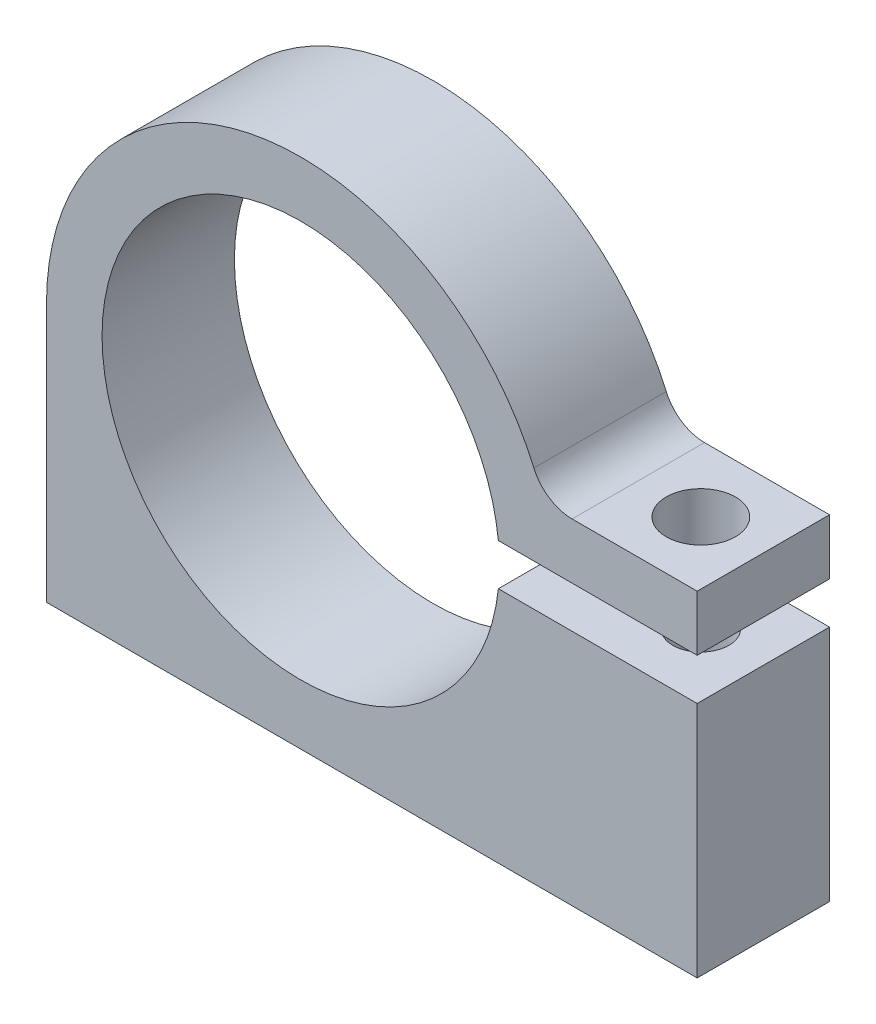
ISO-10303-21;
HEADER;
FILE_DESCRIPTION(('STEP AP214'),'2;1');
FILE_NAME('part.step','',(''),(''),'','','');
FILE_SCHEMA(('AUTOMOTIVE_DESIGN { 1 0 10303 214 1 1 1 1 }'));
ENDSEC;
DATA;
#1=APPLICATION_CONTEXT('core data for automotive mechanical design processes');
#2=APPLICATION_PROTOCOL_DEFINITION('international standard','automotive_design',2000,#1);
#3=PRODUCT_CONTEXT('',#1,'mechanical');
#4=PRODUCT('Part','Part','',(#3));
#5=PRODUCT_RELATED_PRODUCT_CATEGORY('part','',(#4));
#6=PRODUCT_DEFINITION_FORMATION('','',#4);
#7=PRODUCT_DEFINITION_CONTEXT('part definition',#1,'design');
#8=PRODUCT_DEFINITION('design','',#6,#7);
#9=PRODUCT_DEFINITION_SHAPE('','',#8);
#10=(LENGTH_UNIT() NAMED_UNIT(*) SI_UNIT(.MILLI.,.METRE.));
#11=(NAMED_UNIT(*) PLANE_ANGLE_UNIT() SI_UNIT($,.RADIAN.));
#12=(NAMED_UNIT(*) SI_UNIT($,.STERADIAN.) SOLID_ANGLE_UNIT());
#13=UNCERTAINTY_MEASURE_WITH_UNIT(LENGTH_MEASURE(1.E-05),#10,'distance_accuracy_value','');
#14=(GEOMETRIC_REPRESENTATION_CONTEXT(3) GLOBAL_UNCERTAINTY_ASSIGNED_CONTEXT((#13)) GLOBAL_UNIT_ASSIGNED_CONTEXT((#10,
#11,#12)) REPRESENTATION_CONTEXT('',''));
#15=CARTESIAN_POINT('',(0.,0.,0.));
#16=DIRECTION('',(0.,0.,1.));
#17=DIRECTION('',(1.,0.,0.));
#18=AXIS2_PLACEMENT_3D('',#15,#16,#17);
#19=CARTESIAN_POINT('',(0.,5.49999999999999,9.525));
#20=DIRECTION('',(0.,-1.,0.));
#21=DIRECTION('',(1.,0.,0.));
#22=AXIS2_PLACEMENT_3D('',#19,#20,#21);
#23=PLANE('',#22);
#24=CARTESIAN_POINT('',(24.0304889851739,5.5,4.7625));
#25=DIRECTION('',(0.,1.,0.));
#26=DIRECTION('',(0.,0.,1.));
#27=AXIS2_PLACEMENT_3D('',#24,#25,#26);
#28=CIRCLE('',#27,2.4892);
#29=CARTESIAN_POINT('',(24.0304889851739,5.5,7.2517));
#30=VERTEX_POINT('',#29);
#31=EDGE_CURVE('E215',#30,#30,#28,.T.);
#32=ORIENTED_EDGE('',*,*,#31,.F.);
#33=EDGE_LOOP('',(#32));
#34=FACE_BOUND('',#33,.T.);
#35=DIRECTION('',(-1.,0.,0.));
#36=VECTOR('',#35,1.);
#37=CARTESIAN_POINT('',(0.,5.49999999999999,0.));
#38=LINE('',#37,#36);
#39=CARTESIAN_POINT('',(28.5304889851739,5.5,0.));
#40=VERTEX_POINT('',#39);
#41=CARTESIAN_POINT('',(19.5304889851739,5.5,0.));
#42=VERTEX_POINT('',#41);
#43=EDGE_CURVE('E151',#40,#42,#38,.T.);
#44=ORIENTED_EDGE('',*,*,#43,.T.);
#45=DIRECTION('',(0.,0.,-1.));
#46=VECTOR('',#45,1.);
#47=CARTESIAN_POINT('',(19.5304889851739,5.5,9.525));
#48=LINE('',#47,#46);
#49=CARTESIAN_POINT('',(19.5304889851739,5.5,9.525));
#50=VERTEX_POINT('',#49);
#51=EDGE_CURVE('E11',#50,#42,#48,.T.);
#52=ORIENTED_EDGE('',*,*,#51,.F.);
#53=DIRECTION('',(-1.,0.,0.));
#54=VECTOR('',#53,1.);
#55=CARTESIAN_POINT('',(0.,5.49999999999999,9.525));
#56=LINE('',#55,#54);
#57=CARTESIAN_POINT('',(28.5304889851739,5.5,9.525));
#58=VERTEX_POINT('',#57);
#59=EDGE_CURVE('E173',#58,#50,#56,.T.);
#60=ORIENTED_EDGE('',*,*,#59,.F.);
#61=DIRECTION('',(0.,0.,-1.));
#62=VECTOR('',#61,1.);
#63=CARTESIAN_POINT('',(28.5304889851739,5.5,9.525));
#64=LINE('',#63,#62);
#65=EDGE_CURVE('E150',#58,#40,#64,.T.);
#66=ORIENTED_EDGE('',*,*,#65,.T.);
#67=EDGE_LOOP('',(#44,#52,#60,#66));
#68=FACE_BOUND('',#67,.T.);
#69=ADVANCED_FACE('F39',(#34,#68),#23,.F.);
#70=CARTESIAN_POINT('',(19.5304889851739,8.5,9.525));
#71=DIRECTION('',(0.,0.,-1.));
#72=DIRECTION('',(-1.,0.,0.));
#73=AXIS2_PLACEMENT_3D('',#70,#71,#72);
#74=CYLINDRICAL_SURFACE('',#73,3.);
#75=CARTESIAN_POINT('',(19.5304889851739,8.5,0.));
#76=DIRECTION('',(0.,0.,1.));
#77=DIRECTION('',(1.,0.,0.));
#78=AXIS2_PLACEMENT_3D('',#75,#76,#77);
#79=CIRCLE('',#78,3.);
#80=CARTESIAN_POINT('',(16.7797158886706,7.30281690140845,0.));
#81=VERTEX_POINT('',#80);
#82=EDGE_CURVE('E154',#42,#81,#79,.F.);
#83=ORIENTED_EDGE('',*,*,#82,.T.);
#84=DIRECTION('',(0.,0.,-1.));
#85=VECTOR('',#84,1.);
#86=CARTESIAN_POINT('',(16.7797158886706,7.30281690140845,9.525));
#87=LINE('',#86,#85);
#88=CARTESIAN_POINT('',(16.7797158886706,7.30281690140845,9.525));
#89=VERTEX_POINT('',#88);
#90=EDGE_CURVE('E47',#89,#81,#87,.T.);
#91=ORIENTED_EDGE('',*,*,#90,.F.);
#92=CARTESIAN_POINT('',(19.5304889851739,8.5,9.525));
#93=DIRECTION('',(0.,0.,1.));
#94=DIRECTION('',(1.,0.,0.));
#95=AXIS2_PLACEMENT_3D('',#92,#93,#94);
#96=CIRCLE('',#95,3.);
#97=EDGE_CURVE('E104',#50,#89,#96,.F.);
#98=ORIENTED_EDGE('',*,*,#97,.F.);
#99=ORIENTED_EDGE('',*,*,#51,.T.);
#100=EDGE_LOOP('',(#83,#91,#98,#99));
#101=FACE_BOUND('',#100,.T.);
#102=ADVANCED_FACE('F271',(#101),#74,.F.);
#103=CARTESIAN_POINT('',(0.,0.,9.525));
#104=DIRECTION('',(0.,0.,-1.));
#105=DIRECTION('',(-1.,0.,0.));
#106=AXIS2_PLACEMENT_3D('',#103,#104,#105);
#107=CYLINDRICAL_SURFACE('',#106,18.3);
#108=CARTESIAN_POINT('',(0.,0.,0.));
#109=DIRECTION('',(0.,0.,1.));
#110=DIRECTION('',(1.,0.,0.));
#111=AXIS2_PLACEMENT_3D('',#108,#109,#110);
#112=CIRCLE('',#111,18.3);
#113=CARTESIAN_POINT('',(-18.3,0.,0.));
#114=VERTEX_POINT('',#113);
#115=EDGE_CURVE('E157',#81,#114,#112,.T.);
#116=ORIENTED_EDGE('',*,*,#115,.T.);
#117=DIRECTION('',(0.,0.,-1.));
#118=VECTOR('',#117,1.);
#119=CARTESIAN_POINT('',(-18.3,0.,9.525));
#120=LINE('',#119,#118);
#121=CARTESIAN_POINT('',(-18.3,0.,9.525));
#122=VERTEX_POINT('',#121);
#123=EDGE_CURVE('E184',#122,#114,#120,.T.);
#124=ORIENTED_EDGE('',*,*,#123,.F.);
#125=CARTESIAN_POINT('',(0.,0.,9.525));
#126=DIRECTION('',(0.,0.,1.));
#127=DIRECTION('',(1.,0.,0.));
#128=AXIS2_PLACEMENT_3D('',#125,#126,#127);
#129=CIRCLE('',#128,18.3);
#130=EDGE_CURVE('E192',#89,#122,#129,.T.);
#131=ORIENTED_EDGE('',*,*,#130,.F.);
#132=ORIENTED_EDGE('',*,*,#90,.T.);
#133=EDGE_LOOP('',(#116,#124,#131,#132));
#134=FACE_BOUND('',#133,.T.);
#135=ADVANCED_FACE('F190',(#134),#107,.T.);
#136=CARTESIAN_POINT('',(-18.3,0.,9.525));
#137=DIRECTION('',(1.,0.,0.));
#138=DIRECTION('',(0.,1.,0.));
#139=AXIS2_PLACEMENT_3D('',#136,#137,#138);
#140=PLANE('',#139);
#141=DIRECTION('',(0.,-1.,0.));
#142=VECTOR('',#141,1.);
#143=CARTESIAN_POINT('',(-18.3,0.,0.));
#144=LINE('',#143,#142);
#145=CARTESIAN_POINT('',(-18.3,-18.61,0.));
#146=VERTEX_POINT('',#145);
#147=EDGE_CURVE('E159',#114,#146,#144,.T.);
#148=ORIENTED_EDGE('',*,*,#147,.T.);
#149=DIRECTION('',(0.,0.,-1.));
#150=VECTOR('',#149,1.);
#151=CARTESIAN_POINT('',(-18.3,-18.61,9.525));
#152=LINE('',#151,#150);
#153=CARTESIAN_POINT('',(-18.3,-18.61,9.525));
#154=VERTEX_POINT('',#153);
#155=EDGE_CURVE('E181',#154,#146,#152,.T.);
#156=ORIENTED_EDGE('',*,*,#155,.F.);
#157=DIRECTION('',(0.,-1.,0.));
#158=VECTOR('',#157,1.);
#159=CARTESIAN_POINT('',(-18.3,0.,9.525));
#160=LINE('',#159,#158);
#161=EDGE_CURVE('E208',#122,#154,#160,.T.);
#162=ORIENTED_EDGE('',*,*,#161,.F.);
#163=ORIENTED_EDGE('',*,*,#123,.T.);
#164=EDGE_LOOP('',(#148,#156,#162,#163));
#165=FACE_BOUND('',#164,.T.);
#166=ADVANCED_FACE('F200',(#165),#140,.F.);
#167=CARTESIAN_POINT('',(0.,-18.61,9.525));
#168=DIRECTION('',(0.,1.,0.));
#169=DIRECTION('',(0.,0.,1.));
#170=AXIS2_PLACEMENT_3D('',#167,#168,#169);
#171=PLANE('',#170);
#172=CARTESIAN_POINT('',(-12.9695110148261,-18.61,4.7625));
#173=DIRECTION('',(0.,-1.,0.));
#174=DIRECTION('',(0.,0.,-1.));
#175=AXIS2_PLACEMENT_3D('',#172,#173,#174);
#176=CIRCLE('',#175,2.01929999999999);
#177=CARTESIAN_POINT('',(-12.9695110148261,-18.61,2.74320000000001));
#178=VERTEX_POINT('',#177);
#179=EDGE_CURVE('E229',#178,#178,#176,.T.);
#180=ORIENTED_EDGE('',*,*,#179,.F.);
#181=EDGE_LOOP('',(#180));
#182=FACE_BOUND('',#181,.T.);
#183=CARTESIAN_POINT('',(24.0304889851739,-18.61,4.7625));
#184=DIRECTION('',(0.,1.,0.));
#185=DIRECTION('',(0.,0.,1.));
#186=AXIS2_PLACEMENT_3D('',#183,#184,#185);
#187=CIRCLE('',#186,2.0193);
#188=CARTESIAN_POINT('',(24.0304889851739,-18.61,6.7818));
#189=VERTEX_POINT('',#188);
#190=EDGE_CURVE('E218',#189,#189,#187,.T.);
#191=ORIENTED_EDGE('',*,*,#190,.T.);
#192=EDGE_LOOP('',(#191));
#193=FACE_BOUND('',#192,.T.);
#194=DIRECTION('',(1.,0.,0.));
#195=VECTOR('',#194,1.);
#196=CARTESIAN_POINT('',(0.,-18.61,0.));
#197=LINE('',#196,#195);
#198=CARTESIAN_POINT('',(28.5304889851739,-18.61,0.));
#199=VERTEX_POINT('',#198);
#200=EDGE_CURVE('E161',#146,#199,#197,.T.);
#201=ORIENTED_EDGE('',*,*,#200,.T.);
#202=DIRECTION('',(0.,0.,-1.));
#203=VECTOR('',#202,1.);
#204=CARTESIAN_POINT('',(28.5304889851739,-18.61,9.525));
#205=LINE('',#204,#203);
#206=CARTESIAN_POINT('',(28.5304889851739,-18.61,9.525));
#207=VERTEX_POINT('',#206);
#208=EDGE_CURVE('E179',#207,#199,#205,.T.);
#209=ORIENTED_EDGE('',*,*,#208,.F.);
#210=DIRECTION('',(1.,0.,0.));
#211=VECTOR('',#210,1.);
#212=CARTESIAN_POINT('',(0.,-18.61,9.525));
#213=LINE('',#212,#211);
#214=EDGE_CURVE('E206',#154,#207,#213,.T.);
#215=ORIENTED_EDGE('',*,*,#214,.F.);
#216=ORIENTED_EDGE('',*,*,#155,.T.);
#217=EDGE_LOOP('',(#201,#209,#215,#216));
#218=FACE_BOUND('',#217,.T.);
#219=ADVANCED_FACE('F204',(#182,#193,#218),#171,.F.);
#220=CARTESIAN_POINT('',(28.5304889851739,0.,9.525));
#221=DIRECTION('',(1.,0.,0.));
#222=DIRECTION('',(0.,0.,-1.));
#223=AXIS2_PLACEMENT_3D('',#220,#221,#222);
#224=PLANE('',#223);
#225=DIRECTION('',(0.,-1.,0.));
#226=VECTOR('',#225,1.);
#227=CARTESIAN_POINT('',(28.5304889851739,0.,0.));
#228=LINE('',#227,#226);
#229=CARTESIAN_POINT('',(28.5304889851739,-1.5,0.));
#230=VERTEX_POINT('',#229);
#231=EDGE_CURVE('E164',#230,#199,#228,.T.);
#232=ORIENTED_EDGE('',*,*,#231,.F.);
#233=DIRECTION('',(0.,0.,-1.));
#234=VECTOR('',#233,1.);
#235=CARTESIAN_POINT('',(28.5304889851739,-1.5,9.525));
#236=LINE('',#235,#234);
#237=CARTESIAN_POINT('',(28.5304889851739,-1.5,9.525));
#238=VERTEX_POINT('',#237);
#239=EDGE_CURVE('E177',#238,#230,#236,.T.);
#240=ORIENTED_EDGE('',*,*,#239,.F.);
#241=DIRECTION('',(0.,-1.,0.));
#242=VECTOR('',#241,1.);
#243=CARTESIAN_POINT('',(28.5304889851739,0.,9.525));
#244=LINE('',#243,#242);
#245=EDGE_CURVE('E145',#238,#207,#244,.T.);
#246=ORIENTED_EDGE('',*,*,#245,.T.);
#247=ORIENTED_EDGE('',*,*,#208,.T.);
#248=EDGE_LOOP('',(#232,#240,#246,#247));
#249=FACE_BOUND('',#248,.T.);
#250=ADVANCED_FACE('F237',(#249),#224,.T.);
#251=CARTESIAN_POINT('',(0.,-1.5,9.525));
#252=DIRECTION('',(0.,1.,0.));
#253=DIRECTION('',(0.,0.,1.));
#254=AXIS2_PLACEMENT_3D('',#251,#252,#253);
#255=PLANE('',#254);
#256=CARTESIAN_POINT('',(24.0304889851739,-1.5,4.7625));
#257=DIRECTION('',(0.,1.,0.));
#258=DIRECTION('',(0.,0.,1.));
#259=AXIS2_PLACEMENT_3D('',#256,#257,#258);
#260=CIRCLE('',#259,2.01929999999999);
#261=CARTESIAN_POINT('',(24.0304889851739,-1.5,6.78179999999999));
#262=VERTEX_POINT('',#261);
#263=EDGE_CURVE('E223',#262,#262,#260,.T.);
#264=ORIENTED_EDGE('',*,*,#263,.F.);
#265=EDGE_LOOP('',(#264));
#266=FACE_BOUND('',#265,.T.);
#267=DIRECTION('',(1.,0.,0.));
#268=VECTOR('',#267,1.);
#269=CARTESIAN_POINT('',(0.,-1.5,0.));
#270=LINE('',#269,#268);
#271=CARTESIAN_POINT('',(14.2211110677049,-1.5,0.));
#272=VERTEX_POINT('',#271);
#273=EDGE_CURVE('E167',#272,#230,#270,.T.);
#274=ORIENTED_EDGE('',*,*,#273,.F.);
#275=DIRECTION('',(0.,0.,-1.));
#276=VECTOR('',#275,1.);
#277=CARTESIAN_POINT('',(14.2211110677049,-1.5,9.525));
#278=LINE('',#277,#276);
#279=CARTESIAN_POINT('',(14.2211110677049,-1.5,9.525));
#280=VERTEX_POINT('',#279);
#281=EDGE_CURVE('E133',#280,#272,#278,.T.);
#282=ORIENTED_EDGE('',*,*,#281,.F.);
#283=DIRECTION('',(1.,0.,0.));
#284=VECTOR('',#283,1.);
#285=CARTESIAN_POINT('',(0.,-1.5,9.525));
#286=LINE('',#285,#284);
#287=EDGE_CURVE('E143',#280,#238,#286,.T.);
#288=ORIENTED_EDGE('',*,*,#287,.T.);
#289=ORIENTED_EDGE('',*,*,#239,.T.);
#290=EDGE_LOOP('',(#274,#282,#288,#289));
#291=FACE_BOUND('',#290,.T.);
#292=ADVANCED_FACE('F249',(#266,#291),#255,.T.);
#293=CARTESIAN_POINT('',(0.,0.,9.525));
#294=DIRECTION('',(0.,0.,-1.));
#295=DIRECTION('',(-1.,0.,0.));
#296=AXIS2_PLACEMENT_3D('',#293,#294,#295);
#297=CYLINDRICAL_SURFACE('',#296,14.3);
#298=CARTESIAN_POINT('',(0.,0.,0.));
#299=DIRECTION('',(0.,0.,1.));
#300=DIRECTION('',(1.,0.,0.));
#301=AXIS2_PLACEMENT_3D('',#298,#299,#300);
#302=CIRCLE('',#301,14.3);
#303=CARTESIAN_POINT('',(14.2211110677049,1.5,0.));
#304=VERTEX_POINT('',#303);
#305=EDGE_CURVE('E132',#304,#272,#302,.T.);
#306=ORIENTED_EDGE('',*,*,#305,.F.);
#307=DIRECTION('',(0.,0.,-1.));
#308=VECTOR('',#307,1.);
#309=CARTESIAN_POINT('',(14.2211110677049,1.5,9.525));
#310=LINE('',#309,#308);
#311=CARTESIAN_POINT('',(14.2211110677049,1.5,9.525));
#312=VERTEX_POINT('',#311);
#313=EDGE_CURVE('E126',#312,#304,#310,.T.);
#314=ORIENTED_EDGE('',*,*,#313,.F.);
#315=CARTESIAN_POINT('',(0.,0.,9.525));
#316=DIRECTION('',(0.,0.,1.));
#317=DIRECTION('',(1.,0.,0.));
#318=AXIS2_PLACEMENT_3D('',#315,#316,#317);
#319=CIRCLE('',#318,14.3);
#320=EDGE_CURVE('E130',#312,#280,#319,.T.);
#321=ORIENTED_EDGE('',*,*,#320,.T.);
#322=ORIENTED_EDGE('',*,*,#281,.T.);
#323=EDGE_LOOP('',(#306,#314,#321,#322));
#324=FACE_BOUND('',#323,.T.);
#325=ADVANCED_FACE('F128',(#324),#297,.F.);
#326=CARTESIAN_POINT('',(0.,1.5,9.525));
#327=DIRECTION('',(0.,1.,0.));
#328=DIRECTION('',(0.,0.,1.));
#329=AXIS2_PLACEMENT_3D('',#326,#327,#328);
#330=PLANE('',#329);
#331=CARTESIAN_POINT('',(24.0304889851739,1.5,4.7625));
#332=DIRECTION('',(0.,1.,0.));
#333=DIRECTION('',(0.,0.,1.));
#334=AXIS2_PLACEMENT_3D('',#331,#332,#333);
#335=CIRCLE('',#334,2.4892);
#336=CARTESIAN_POINT('',(24.0304889851739,1.5,7.2517));
#337=VERTEX_POINT('',#336);
#338=EDGE_CURVE('E155',#337,#337,#335,.F.);
#339=ORIENTED_EDGE('',*,*,#338,.F.);
#340=EDGE_LOOP('',(#339));
#341=FACE_BOUND('',#340,.T.);
#342=DIRECTION('',(1.,0.,0.));
#343=VECTOR('',#342,1.);
#344=CARTESIAN_POINT('',(0.,1.5,0.));
#345=LINE('',#344,#343);
#346=CARTESIAN_POINT('',(28.5304889851739,1.5,0.));
#347=VERTEX_POINT('',#346);
#348=EDGE_CURVE('E90',#304,#347,#345,.T.);
#349=ORIENTED_EDGE('',*,*,#348,.T.);
#350=DIRECTION('',(0.,0.,-1.));
#351=VECTOR('',#350,1.);
#352=CARTESIAN_POINT('',(28.5304889851739,1.5,9.525));
#353=LINE('',#352,#351);
#354=CARTESIAN_POINT('',(28.5304889851739,1.5,9.525));
#355=VERTEX_POINT('',#354);
#356=EDGE_CURVE('E134',#355,#347,#353,.T.);
#357=ORIENTED_EDGE('',*,*,#356,.F.);
#358=DIRECTION('',(1.,0.,0.));
#359=VECTOR('',#358,1.);
#360=CARTESIAN_POINT('',(0.,1.5,9.525));
#361=LINE('',#360,#359);
#362=EDGE_CURVE('E136',#312,#355,#361,.T.);
#363=ORIENTED_EDGE('',*,*,#362,.F.);
#364=ORIENTED_EDGE('',*,*,#313,.T.);
#365=EDGE_LOOP('',(#349,#357,#363,#364));
#366=FACE_BOUND('',#365,.T.);
#367=ADVANCED_FACE('F137',(#341,#366),#330,.F.);
#368=CARTESIAN_POINT('',(28.5304889851739,0.,9.525));
#369=DIRECTION('',(-1.,0.,0.));
#370=DIRECTION('',(0.,0.,1.));
#371=AXIS2_PLACEMENT_3D('',#368,#369,#370);
#372=PLANE('',#371);
#373=DIRECTION('',(0.,1.,0.));
#374=VECTOR('',#373,1.);
#375=CARTESIAN_POINT('',(28.5304889851739,0.,0.));
#376=LINE('',#375,#374);
#377=EDGE_CURVE('E96',#347,#40,#376,.T.);
#378=ORIENTED_EDGE('',*,*,#377,.T.);
#379=ORIENTED_EDGE('',*,*,#65,.F.);
#380=DIRECTION('',(0.,1.,0.));
#381=VECTOR('',#380,1.);
#382=CARTESIAN_POINT('',(28.5304889851739,0.,9.525));
#383=LINE('',#382,#381);
#384=EDGE_CURVE('E55',#355,#58,#383,.T.);
#385=ORIENTED_EDGE('',*,*,#384,.F.);
#386=ORIENTED_EDGE('',*,*,#356,.T.);
#387=EDGE_LOOP('',(#378,#379,#385,#386));
#388=FACE_BOUND('',#387,.T.);
#389=ADVANCED_FACE('F258',(#388),#372,.F.);
#390=CARTESIAN_POINT('',(0.,0.,9.525));
#391=DIRECTION('',(0.,0.,1.));
#392=DIRECTION('',(1.,0.,0.));
#393=AXIS2_PLACEMENT_3D('',#390,#391,#392);
#394=PLANE('',#393);
#395=ORIENTED_EDGE('',*,*,#59,.T.);
#396=ORIENTED_EDGE('',*,*,#97,.T.);
#397=ORIENTED_EDGE('',*,*,#130,.T.);
#398=ORIENTED_EDGE('',*,*,#161,.T.);
#399=ORIENTED_EDGE('',*,*,#214,.T.);
#400=ORIENTED_EDGE('',*,*,#245,.F.);
#401=ORIENTED_EDGE('',*,*,#287,.F.);
#402=ORIENTED_EDGE('',*,*,#320,.F.);
#403=ORIENTED_EDGE('',*,*,#362,.T.);
#404=ORIENTED_EDGE('',*,*,#384,.T.);
#405=EDGE_LOOP('',(#395,#396,#397,#398,#399,#400,#401,#402,#403,#404));
#406=FACE_BOUND('',#405,.T.);
#407=ADVANCED_FACE('F140',(#406),#394,.T.);
#408=CARTESIAN_POINT('',(0.,0.,0.));
#409=DIRECTION('',(0.,0.,1.));
#410=DIRECTION('',(1.,0.,0.));
#411=AXIS2_PLACEMENT_3D('',#408,#409,#410);
#412=PLANE('',#411);
#413=ORIENTED_EDGE('',*,*,#43,.F.);
#414=ORIENTED_EDGE('',*,*,#377,.F.);
#415=ORIENTED_EDGE('',*,*,#348,.F.);
#416=ORIENTED_EDGE('',*,*,#305,.T.);
#417=ORIENTED_EDGE('',*,*,#273,.T.);
#418=ORIENTED_EDGE('',*,*,#231,.T.);
#419=ORIENTED_EDGE('',*,*,#200,.F.);
#420=ORIENTED_EDGE('',*,*,#147,.F.);
#421=ORIENTED_EDGE('',*,*,#115,.F.);
#422=ORIENTED_EDGE('',*,*,#82,.F.);
#423=EDGE_LOOP('',(#413,#414,#415,#416,#417,#418,#419,#420,#421,#422));
#424=FACE_BOUND('',#423,.T.);
#425=ADVANCED_FACE('F196',(#424),#412,.F.);
#426=CARTESIAN_POINT('',(24.0304889851739,5.5,4.7625));
#427=DIRECTION('',(0.,1.,0.));
#428=DIRECTION('',(0.,0.,1.));
#429=AXIS2_PLACEMENT_3D('',#426,#427,#428);
#430=CYLINDRICAL_SURFACE('',#429,2.4892);
#431=ORIENTED_EDGE('',*,*,#338,.T.);
#432=EDGE_LOOP('',(#431));
#433=FACE_BOUND('',#432,.T.);
#434=ORIENTED_EDGE('',*,*,#31,.T.);
#435=EDGE_LOOP('',(#434));
#436=FACE_BOUND('',#435,.T.);
#437=ADVANCED_FACE('F245',(#433,#436),#430,.F.);
#438=CARTESIAN_POINT('',(24.0304889851739,-1.5,4.7625));
#439=DIRECTION('',(0.,1.,0.));
#440=DIRECTION('',(0.,0.,1.));
#441=AXIS2_PLACEMENT_3D('',#438,#439,#440);
#442=CYLINDRICAL_SURFACE('',#441,2.01929999999999);
#443=ORIENTED_EDGE('',*,*,#190,.F.);
#444=EDGE_LOOP('',(#443));
#445=FACE_BOUND('',#444,.T.);
#446=ORIENTED_EDGE('',*,*,#263,.T.);
#447=EDGE_LOOP('',(#446));
#448=FACE_BOUND('',#447,.T.);
#449=ADVANCED_FACE('F241',(#445,#448),#442,.F.);
#450=CARTESIAN_POINT('',(-12.9695110148261,-11.61,4.7625));
#451=DIRECTION('',(0.,-1.,0.));
#452=DIRECTION('',(0.,0.,-1.));
#453=AXIS2_PLACEMENT_3D('',#450,#451,#452);
#454=CONICAL_SURFACE('',#453,2.0193,1.02974425867665);
#455=CARTESIAN_POINT('',(-12.9695110148261,-10.3966821519976,4.7625));
#456=VERTEX_POINT('',#455);
#457=VERTEX_LOOP('',#456);
#458=FACE_BOUND('',#457,.T.);
#459=CARTESIAN_POINT('',(-12.9695110148261,-11.61,4.7625));
#460=DIRECTION('',(0.,-1.,0.));
#461=DIRECTION('',(0.,0.,-1.));
#462=AXIS2_PLACEMENT_3D('',#459,#460,#461);
#463=CIRCLE('',#462,2.0193);
#464=CARTESIAN_POINT('',(-12.9695110148261,-11.61,2.7432));
#465=VERTEX_POINT('',#464);
#466=EDGE_CURVE('E226',#465,#465,#463,.T.);
#467=ORIENTED_EDGE('',*,*,#466,.T.);
#468=EDGE_LOOP('',(#467));
#469=FACE_BOUND('',#468,.T.);
#470=ADVANCED_FACE('F244',(#458,#469),#454,.F.);
#471=CARTESIAN_POINT('',(-12.9695110148261,-18.61,4.7625));
#472=DIRECTION('',(0.,-1.,0.));
#473=DIRECTION('',(0.,0.,-1.));
#474=AXIS2_PLACEMENT_3D('',#471,#472,#473);
#475=CYLINDRICAL_SURFACE('',#474,2.01929999999999);
#476=ORIENTED_EDGE('',*,*,#466,.F.);
#477=EDGE_LOOP('',(#476));
#478=FACE_BOUND('',#477,.T.);
#479=ORIENTED_EDGE('',*,*,#179,.T.);
#480=EDGE_LOOP('',(#479));
#481=FACE_BOUND('',#480,.T.);
#482=ADVANCED_FACE('F233',(#478,#481),#475,.F.);
#483=CLOSED_SHELL('',(#69,#102,#135,#166,#219,#250,#292,#325,#367,#389,#407,#425,#437,#449,#470,#482));
#484=MANIFOLD_SOLID_BREP('B2',#483);
#485=ADVANCED_BREP_SHAPE_REPRESENTATION('',(#18,#484),#14);
#486=SHAPE_DEFINITION_REPRESENTATION(#9,#485);
ENDSEC;
END-ISO-10303-21;
